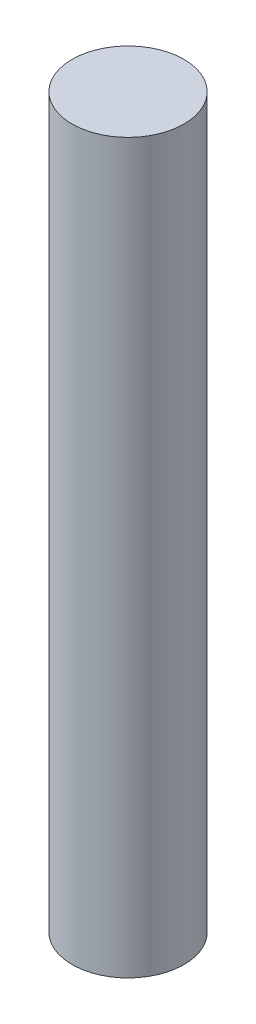
ISO-10303-21;
HEADER;
FILE_DESCRIPTION(('STEP AP214'),'2;1');
FILE_NAME('part.step','',(''),(''),'','','');
FILE_SCHEMA(('AUTOMOTIVE_DESIGN { 1 0 10303 214 1 1 1 1 }'));
ENDSEC;
DATA;
#1=APPLICATION_CONTEXT('core data for automotive mechanical design processes');
#2=APPLICATION_PROTOCOL_DEFINITION('international standard','automotive_design',2000,#1);
#3=PRODUCT_CONTEXT('',#1,'mechanical');
#4=PRODUCT('Part','Part','',(#3));
#5=PRODUCT_RELATED_PRODUCT_CATEGORY('part','',(#4));
#6=PRODUCT_DEFINITION_FORMATION('','',#4);
#7=PRODUCT_DEFINITION_CONTEXT('part definition',#1,'design');
#8=PRODUCT_DEFINITION('design','',#6,#7);
#9=PRODUCT_DEFINITION_SHAPE('','',#8);
#10=(LENGTH_UNIT() NAMED_UNIT(*) SI_UNIT(.MILLI.,.METRE.));
#11=(NAMED_UNIT(*) PLANE_ANGLE_UNIT() SI_UNIT($,.RADIAN.));
#12=(NAMED_UNIT(*) SI_UNIT($,.STERADIAN.) SOLID_ANGLE_UNIT());
#13=UNCERTAINTY_MEASURE_WITH_UNIT(LENGTH_MEASURE(1.E-05),#10,'distance_accuracy_value','');
#14=(GEOMETRIC_REPRESENTATION_CONTEXT(3) GLOBAL_UNCERTAINTY_ASSIGNED_CONTEXT((#13)) GLOBAL_UNIT_ASSIGNED_CONTEXT((#10,
#11,#12)) REPRESENTATION_CONTEXT('',''));
#15=CARTESIAN_POINT('',(0.,0.,0.));
#16=DIRECTION('',(0.,0.,1.));
#17=DIRECTION('',(1.,0.,0.));
#18=AXIS2_PLACEMENT_3D('',#15,#16,#17);
#19=CARTESIAN_POINT('',(0.,13.,0.));
#20=DIRECTION('',(0.,-1.,0.));
#21=DIRECTION('',(0.,0.,-1.));
#22=AXIS2_PLACEMENT_3D('',#19,#20,#21);
#23=CYLINDRICAL_SURFACE('',#22,1.);
#24=CARTESIAN_POINT('',(0.,13.,0.));
#25=DIRECTION('',(0.,1.,0.));
#26=DIRECTION('',(0.,0.,1.));
#27=AXIS2_PLACEMENT_3D('',#24,#25,#26);
#28=CIRCLE('',#27,1.);
#29=CARTESIAN_POINT('',(0.,13.,-1.));
#30=VERTEX_POINT('',#29);
#31=EDGE_CURVE('E10',#30,#30,#28,.T.);
#32=CARTESIAN_POINT('',(0.,0.,0.));
#33=DIRECTION('',(0.,1.,0.));
#34=DIRECTION('',(0.,0.,1.));
#35=AXIS2_PLACEMENT_3D('',#32,#33,#34);
#36=CIRCLE('',#35,1.);
#37=CARTESIAN_POINT('',(0.,0.,-1.));
#38=VERTEX_POINT('',#37);
#39=EDGE_CURVE('E31',#38,#38,#36,.T.);
#40=CARTESIAN_POINT('',(0.,13.,-1.));
#41=CARTESIAN_POINT('',(0.,12.8645833333333,-1.));
#42=CARTESIAN_POINT('',(0.,12.7291666666667,-1.));
#43=CARTESIAN_POINT('',(0.,12.4583333333333,-1.));
#44=CARTESIAN_POINT('',(0.,12.3229166666667,-1.));
#45=CARTESIAN_POINT('',(0.,12.0520833333333,-1.));
#46=CARTESIAN_POINT('',(0.,11.9166666666667,-1.));
#47=CARTESIAN_POINT('',(0.,11.6458333333333,-1.));
#48=CARTESIAN_POINT('',(0.,11.5104166666667,-1.));
#49=CARTESIAN_POINT('',(0.,11.2395833333333,-1.));
#50=CARTESIAN_POINT('',(0.,11.1041666666667,-1.));
#51=CARTESIAN_POINT('',(0.,10.8333333333333,-1.));
#52=CARTESIAN_POINT('',(0.,10.6979166666667,-1.));
#53=CARTESIAN_POINT('',(0.,10.4270833333333,-1.));
#54=CARTESIAN_POINT('',(0.,10.2916666666667,-1.));
#55=CARTESIAN_POINT('',(0.,10.0208333333333,-1.));
#56=CARTESIAN_POINT('',(0.,9.88541666666667,-1.));
#57=CARTESIAN_POINT('',(0.,9.61458333333333,-1.));
#58=CARTESIAN_POINT('',(0.,9.47916666666667,-1.));
#59=CARTESIAN_POINT('',(0.,9.20833333333333,-1.));
#60=CARTESIAN_POINT('',(0.,9.07291666666666,-1.));
#61=CARTESIAN_POINT('',(0.,8.80208333333333,-1.));
#62=CARTESIAN_POINT('',(0.,8.66666666666667,-1.));
#63=CARTESIAN_POINT('',(0.,8.39583333333333,-1.));
#64=CARTESIAN_POINT('',(0.,8.26041666666667,-1.));
#65=CARTESIAN_POINT('',(0.,7.98958333333333,-1.));
#66=CARTESIAN_POINT('',(0.,7.85416666666667,-1.));
#67=CARTESIAN_POINT('',(0.,7.58333333333333,-1.));
#68=CARTESIAN_POINT('',(0.,7.44791666666667,-1.));
#69=CARTESIAN_POINT('',(0.,7.17708333333333,-1.));
#70=CARTESIAN_POINT('',(0.,7.04166666666667,-1.));
#71=CARTESIAN_POINT('',(0.,6.77083333333333,-1.));
#72=CARTESIAN_POINT('',(0.,6.63541666666667,-1.));
#73=CARTESIAN_POINT('',(0.,6.36458333333333,-1.));
#74=CARTESIAN_POINT('',(0.,6.22916666666667,-1.));
#75=CARTESIAN_POINT('',(0.,5.95833333333333,-1.));
#76=CARTESIAN_POINT('',(0.,5.82291666666667,-1.));
#77=CARTESIAN_POINT('',(0.,5.55208333333333,-1.));
#78=CARTESIAN_POINT('',(0.,5.41666666666667,-1.));
#79=CARTESIAN_POINT('',(0.,5.14583333333333,-1.));
#80=CARTESIAN_POINT('',(0.,5.01041666666667,-1.));
#81=CARTESIAN_POINT('',(0.,4.73958333333333,-1.));
#82=CARTESIAN_POINT('',(0.,4.60416666666667,-1.));
#83=CARTESIAN_POINT('',(0.,4.33333333333333,-1.));
#84=CARTESIAN_POINT('',(0.,4.19791666666667,-1.));
#85=CARTESIAN_POINT('',(0.,3.92708333333333,-1.));
#86=CARTESIAN_POINT('',(0.,3.79166666666667,-1.));
#87=CARTESIAN_POINT('',(0.,3.52083333333333,-1.));
#88=CARTESIAN_POINT('',(0.,3.38541666666667,-1.));
#89=CARTESIAN_POINT('',(0.,3.11458333333333,-1.));
#90=CARTESIAN_POINT('',(0.,2.97916666666667,-1.));
#91=CARTESIAN_POINT('',(0.,2.70833333333333,-1.));
#92=CARTESIAN_POINT('',(0.,2.57291666666667,-1.));
#93=CARTESIAN_POINT('',(0.,2.30208333333333,-1.));
#94=CARTESIAN_POINT('',(0.,2.16666666666667,-1.));
#95=CARTESIAN_POINT('',(0.,1.89583333333333,-1.));
#96=CARTESIAN_POINT('',(0.,1.76041666666667,-1.));
#97=CARTESIAN_POINT('',(0.,1.48958333333333,-1.));
#98=CARTESIAN_POINT('',(0.,1.35416666666667,-1.));
#99=CARTESIAN_POINT('',(0.,1.08333333333333,-1.));
#100=CARTESIAN_POINT('',(0.,0.947916666666667,-1.));
#101=CARTESIAN_POINT('',(0.,0.677083333333334,-1.));
#102=CARTESIAN_POINT('',(0.,0.541666666666667,-1.));
#103=CARTESIAN_POINT('',(0.,0.270833333333334,-1.));
#104=CARTESIAN_POINT('',(0.,0.135416666666667,-1.));
#105=CARTESIAN_POINT('',(0.,0.,-1.));
#106=B_SPLINE_CURVE_WITH_KNOTS('',3,(#40,#41,#42,#43,#44,#45,#46,#47,#48,#49,#50,#51,#52,#53,
#54,#55,#56,#57,#58,#59,#60,#61,#62,#63,#64,#65,#66,#67,#68,#69,#70,#71,#72,#73,#74,#75,#76,#77,
#78,#79,#80,#81,#82,#83,#84,#85,#86,#87,#88,#89,#90,#91,#92,#93,#94,#95,#96,#97,#98,#99,#100,
#101,#102,#103,#104,#105),.UNSPECIFIED.,.F.,.F.,(4,2,2,2,2,2,2,2,2,2,2,2,2,2,2,2,2,2,2,2,2,2,2,
2,2,2,2,2,2,2,2,2,4),(0.,0.40625,0.812500000000001,1.21875,1.625,2.03125,2.4375,2.84375,3.25,
3.65625,4.0625,4.46875,4.875,5.28125,5.6875,6.09375,6.5,6.90625,7.3125,7.71875,8.125,8.53125,
8.9375,9.34375,9.75,10.15625,10.5625,10.96875,11.375,11.78125,12.1875,12.59375,13.),.UNSPECIFIED.);
#107=EDGE_CURVE('BSEAM28',#30,#38,#106,.T.);
#108=ORIENTED_EDGE('',*,*,#31,.F.);
#109=ORIENTED_EDGE('',*,*,#39,.T.);
#110=ORIENTED_EDGE('',*,*,#107,.T.);
#111=ORIENTED_EDGE('',*,*,#107,.F.);
#112=EDGE_LOOP('',(#108,#110,#109,#111));
#113=FACE_BOUND('',#112,.T.);
#114=ADVANCED_FACE('F28',(#113),#23,.T.);
#115=CARTESIAN_POINT('',(0.,13.,0.));
#116=DIRECTION('',(0.,1.,0.));
#117=DIRECTION('',(0.,0.,1.));
#118=AXIS2_PLACEMENT_3D('',#115,#116,#117);
#119=PLANE('',#118);
#120=ORIENTED_EDGE('',*,*,#31,.T.);
#121=EDGE_LOOP('',(#120));
#122=FACE_BOUND('',#121,.T.);
#123=ADVANCED_FACE('F43',(#122),#119,.T.);
#124=CARTESIAN_POINT('',(0.,0.,0.));
#125=DIRECTION('',(0.,1.,0.));
#126=DIRECTION('',(0.,0.,1.));
#127=AXIS2_PLACEMENT_3D('',#124,#125,#126);
#128=PLANE('',#127);
#129=ORIENTED_EDGE('',*,*,#39,.F.);
#130=EDGE_LOOP('',(#129));
#131=FACE_BOUND('',#130,.T.);
#132=ADVANCED_FACE('F41',(#131),#128,.F.);
#133=CLOSED_SHELL('',(#114,#123,#132));
#134=MANIFOLD_SOLID_BREP('B2',#133);
#135=ADVANCED_BREP_SHAPE_REPRESENTATION('',(#18,#134),#14);
#136=SHAPE_DEFINITION_REPRESENTATION(#9,#135);
ENDSEC;
END-ISO-10303-21;
